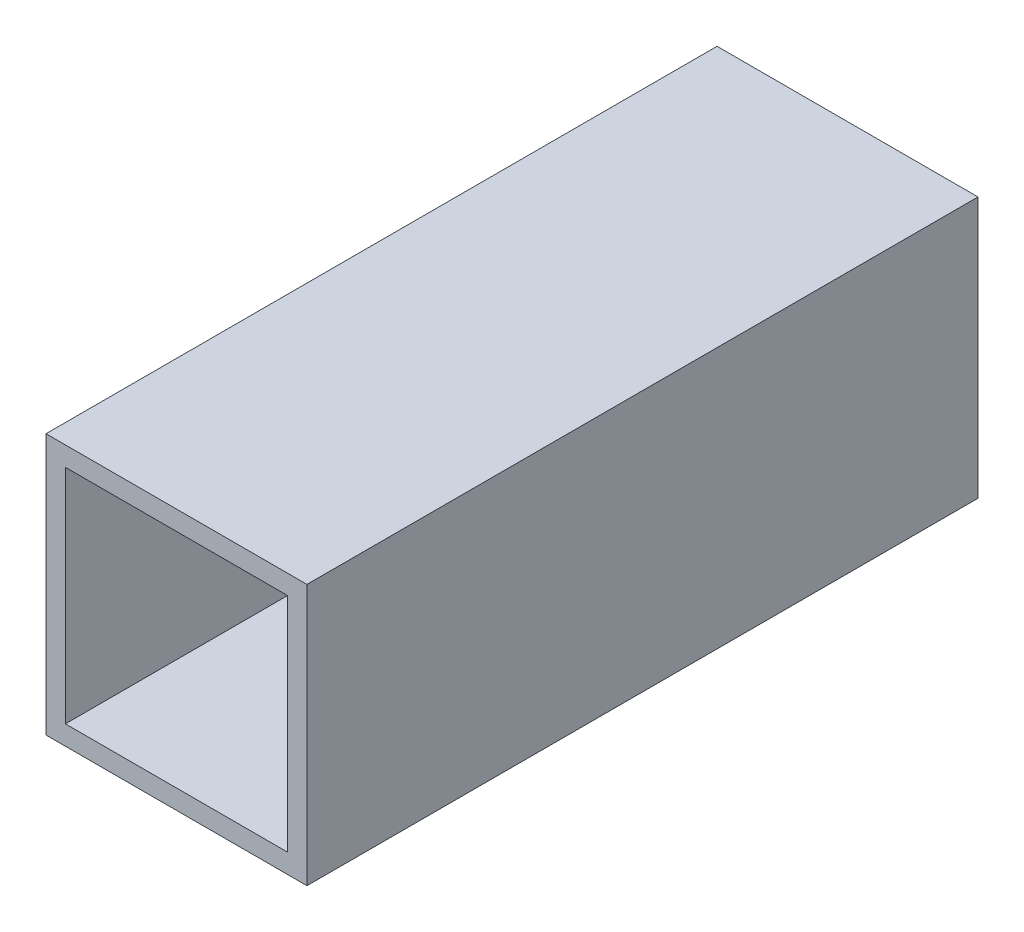
ISO-10303-21;
HEADER;
FILE_DESCRIPTION(('STEP AP214'),'2;1');
FILE_NAME('part.step','',(''),(''),'','','');
FILE_SCHEMA(('AUTOMOTIVE_DESIGN { 1 0 10303 214 1 1 1 1 }'));
ENDSEC;
DATA;
#1=APPLICATION_CONTEXT('core data for automotive mechanical design processes');
#2=APPLICATION_PROTOCOL_DEFINITION('international standard','automotive_design',2000,#1);
#3=PRODUCT_CONTEXT('',#1,'mechanical');
#4=PRODUCT('Part','Part','',(#3));
#5=PRODUCT_RELATED_PRODUCT_CATEGORY('part','',(#4));
#6=PRODUCT_DEFINITION_FORMATION('','',#4);
#7=PRODUCT_DEFINITION_CONTEXT('part definition',#1,'design');
#8=PRODUCT_DEFINITION('design','',#6,#7);
#9=PRODUCT_DEFINITION_SHAPE('','',#8);
#10=(LENGTH_UNIT() NAMED_UNIT(*) SI_UNIT(.MILLI.,.METRE.));
#11=(NAMED_UNIT(*) PLANE_ANGLE_UNIT() SI_UNIT($,.RADIAN.));
#12=(NAMED_UNIT(*) SI_UNIT($,.STERADIAN.) SOLID_ANGLE_UNIT());
#13=UNCERTAINTY_MEASURE_WITH_UNIT(LENGTH_MEASURE(1.E-05),#10,'distance_accuracy_value','');
#14=(GEOMETRIC_REPRESENTATION_CONTEXT(3) GLOBAL_UNCERTAINTY_ASSIGNED_CONTEXT((#13)) GLOBAL_UNIT_ASSIGNED_CONTEXT((#10,
#11,#12)) REPRESENTATION_CONTEXT('',''));
#15=CARTESIAN_POINT('',(0.,0.,0.));
#16=DIRECTION('',(0.,0.,1.));
#17=DIRECTION('',(1.,0.,0.));
#18=AXIS2_PLACEMENT_3D('',#15,#16,#17);
#19=CARTESIAN_POINT('',(0.,0.,114.3));
#20=DIRECTION('',(0.,0.,1.));
#21=DIRECTION('',(1.,0.,0.));
#22=AXIS2_PLACEMENT_3D('',#19,#20,#21);
#23=PLANE('',#22);
#24=DIRECTION('',(0.,1.,0.));
#25=VECTOR('',#24,1.);
#26=CARTESIAN_POINT('',(22.225,22.225,114.3));
#27=LINE('',#26,#25);
#28=CARTESIAN_POINT('',(22.225,-22.225,114.3));
#29=VERTEX_POINT('',#28);
#30=CARTESIAN_POINT('',(22.225,22.225,114.3));
#31=VERTEX_POINT('',#30);
#32=EDGE_CURVE('E149',#29,#31,#27,.T.);
#33=ORIENTED_EDGE('',*,*,#32,.T.);
#34=DIRECTION('',(-1.,0.,0.));
#35=VECTOR('',#34,1.);
#36=CARTESIAN_POINT('',(-22.225,22.225,114.3));
#37=LINE('',#36,#35);
#38=CARTESIAN_POINT('',(-22.225,22.225,114.3));
#39=VERTEX_POINT('',#38);
#40=EDGE_CURVE('E153',#31,#39,#37,.T.);
#41=ORIENTED_EDGE('',*,*,#40,.T.);
#42=DIRECTION('',(0.,-1.,0.));
#43=VECTOR('',#42,1.);
#44=CARTESIAN_POINT('',(-22.225,22.225,114.3));
#45=LINE('',#44,#43);
#46=CARTESIAN_POINT('',(-22.225,-22.225,114.3));
#47=VERTEX_POINT('',#46);
#48=EDGE_CURVE('E157',#39,#47,#45,.T.);
#49=ORIENTED_EDGE('',*,*,#48,.T.);
#50=DIRECTION('',(1.,0.,0.));
#51=VECTOR('',#50,1.);
#52=CARTESIAN_POINT('',(-22.225,-22.225,114.3));
#53=LINE('',#52,#51);
#54=EDGE_CURVE('E160',#47,#29,#53,.T.);
#55=ORIENTED_EDGE('',*,*,#54,.T.);
#56=EDGE_LOOP('',(#33,#41,#49,#55));
#57=FACE_BOUND('',#56,.T.);
#58=DIRECTION('',(-1.,0.,0.));
#59=VECTOR('',#58,1.);
#60=CARTESIAN_POINT('',(-18.923,18.923,114.3));
#61=LINE('',#60,#59);
#62=CARTESIAN_POINT('',(18.923,18.923,114.3));
#63=VERTEX_POINT('',#62);
#64=CARTESIAN_POINT('',(-18.923,18.923,114.3));
#65=VERTEX_POINT('',#64);
#66=EDGE_CURVE('E109',#63,#65,#61,.T.);
#67=ORIENTED_EDGE('',*,*,#66,.F.);
#68=DIRECTION('',(0.,1.,0.));
#69=VECTOR('',#68,1.);
#70=CARTESIAN_POINT('',(18.923,18.923,114.3));
#71=LINE('',#70,#69);
#72=CARTESIAN_POINT('',(18.923,-18.923,114.3));
#73=VERTEX_POINT('',#72);
#74=EDGE_CURVE('E100',#73,#63,#71,.T.);
#75=ORIENTED_EDGE('',*,*,#74,.F.);
#76=DIRECTION('',(1.,0.,0.));
#77=VECTOR('',#76,1.);
#78=CARTESIAN_POINT('',(-18.923,-18.923,114.3));
#79=LINE('',#78,#77);
#80=CARTESIAN_POINT('',(-18.923,-18.923,114.3));
#81=VERTEX_POINT('',#80);
#82=EDGE_CURVE('E127',#81,#73,#79,.T.);
#83=ORIENTED_EDGE('',*,*,#82,.F.);
#84=DIRECTION('',(0.,-1.,0.));
#85=VECTOR('',#84,1.);
#86=CARTESIAN_POINT('',(-18.923,18.923,114.3));
#87=LINE('',#86,#85);
#88=EDGE_CURVE('E122',#65,#81,#87,.T.);
#89=ORIENTED_EDGE('',*,*,#88,.F.);
#90=EDGE_LOOP('',(#67,#75,#83,#89));
#91=FACE_BOUND('',#90,.T.);
#92=ADVANCED_FACE('F34',(#57,#91),#23,.T.);
#93=CARTESIAN_POINT('',(0.,0.,0.));
#94=DIRECTION('',(0.,0.,1.));
#95=DIRECTION('',(1.,0.,0.));
#96=AXIS2_PLACEMENT_3D('',#93,#94,#95);
#97=PLANE('',#96);
#98=DIRECTION('',(0.,1.,0.));
#99=VECTOR('',#98,1.);
#100=CARTESIAN_POINT('',(22.225,22.225,0.));
#101=LINE('',#100,#99);
#102=CARTESIAN_POINT('',(22.225,-22.225,0.));
#103=VERTEX_POINT('',#102);
#104=CARTESIAN_POINT('',(22.225,22.225,0.));
#105=VERTEX_POINT('',#104);
#106=EDGE_CURVE('E118',#103,#105,#101,.T.);
#107=ORIENTED_EDGE('',*,*,#106,.F.);
#108=DIRECTION('',(1.,0.,0.));
#109=VECTOR('',#108,1.);
#110=CARTESIAN_POINT('',(-22.225,-22.225,0.));
#111=LINE('',#110,#109);
#112=CARTESIAN_POINT('',(-22.225,-22.225,0.));
#113=VERTEX_POINT('',#112);
#114=EDGE_CURVE('E154',#113,#103,#111,.T.);
#115=ORIENTED_EDGE('',*,*,#114,.F.);
#116=DIRECTION('',(0.,-1.,0.));
#117=VECTOR('',#116,1.);
#118=CARTESIAN_POINT('',(-22.225,22.225,0.));
#119=LINE('',#118,#117);
#120=CARTESIAN_POINT('',(-22.225,22.225,0.));
#121=VERTEX_POINT('',#120);
#122=EDGE_CURVE('E170',#121,#113,#119,.T.);
#123=ORIENTED_EDGE('',*,*,#122,.F.);
#124=DIRECTION('',(-1.,0.,0.));
#125=VECTOR('',#124,1.);
#126=CARTESIAN_POINT('',(-22.225,22.225,0.));
#127=LINE('',#126,#125);
#128=EDGE_CURVE('E167',#105,#121,#127,.T.);
#129=ORIENTED_EDGE('',*,*,#128,.F.);
#130=EDGE_LOOP('',(#107,#115,#123,#129));
#131=FACE_BOUND('',#130,.T.);
#132=DIRECTION('',(0.,1.,0.));
#133=VECTOR('',#132,1.);
#134=CARTESIAN_POINT('',(18.923,18.923,0.));
#135=LINE('',#134,#133);
#136=CARTESIAN_POINT('',(18.923,-18.923,0.));
#137=VERTEX_POINT('',#136);
#138=CARTESIAN_POINT('',(18.923,18.923,0.));
#139=VERTEX_POINT('',#138);
#140=EDGE_CURVE('E58',#137,#139,#135,.T.);
#141=ORIENTED_EDGE('',*,*,#140,.T.);
#142=DIRECTION('',(-1.,0.,0.));
#143=VECTOR('',#142,1.);
#144=CARTESIAN_POINT('',(-18.923,18.923,0.));
#145=LINE('',#144,#143);
#146=CARTESIAN_POINT('',(-18.923,18.923,0.));
#147=VERTEX_POINT('',#146);
#148=EDGE_CURVE('E116',#139,#147,#145,.T.);
#149=ORIENTED_EDGE('',*,*,#148,.T.);
#150=DIRECTION('',(0.,-1.,0.));
#151=VECTOR('',#150,1.);
#152=CARTESIAN_POINT('',(-18.923,18.923,0.));
#153=LINE('',#152,#151);
#154=CARTESIAN_POINT('',(-18.923,-18.923,0.));
#155=VERTEX_POINT('',#154);
#156=EDGE_CURVE('E136',#147,#155,#153,.T.);
#157=ORIENTED_EDGE('',*,*,#156,.T.);
#158=DIRECTION('',(1.,0.,0.));
#159=VECTOR('',#158,1.);
#160=CARTESIAN_POINT('',(-18.923,-18.923,0.));
#161=LINE('',#160,#159);
#162=EDGE_CURVE('E110',#155,#137,#161,.T.);
#163=ORIENTED_EDGE('',*,*,#162,.T.);
#164=EDGE_LOOP('',(#141,#149,#157,#163));
#165=FACE_BOUND('',#164,.T.);
#166=ADVANCED_FACE('F194',(#131,#165),#97,.F.);
#167=CARTESIAN_POINT('',(22.225,22.225,114.3));
#168=DIRECTION('',(-1.,0.,0.));
#169=DIRECTION('',(0.,-1.,0.));
#170=AXIS2_PLACEMENT_3D('',#167,#168,#169);
#171=PLANE('',#170);
#172=ORIENTED_EDGE('',*,*,#106,.T.);
#173=DIRECTION('',(0.,0.,-1.));
#174=VECTOR('',#173,1.);
#175=CARTESIAN_POINT('',(22.225,22.225,114.3));
#176=LINE('',#175,#174);
#177=EDGE_CURVE('E11',#31,#105,#176,.T.);
#178=ORIENTED_EDGE('',*,*,#177,.F.);
#179=ORIENTED_EDGE('',*,*,#32,.F.);
#180=DIRECTION('',(0.,0.,-1.));
#181=VECTOR('',#180,1.);
#182=CARTESIAN_POINT('',(22.225,-22.225,114.3));
#183=LINE('',#182,#181);
#184=EDGE_CURVE('E163',#29,#103,#183,.T.);
#185=ORIENTED_EDGE('',*,*,#184,.T.);
#186=EDGE_LOOP('',(#172,#178,#179,#185));
#187=FACE_BOUND('',#186,.T.);
#188=ADVANCED_FACE('F36',(#187),#171,.F.);
#189=CARTESIAN_POINT('',(-22.225,22.225,114.3));
#190=DIRECTION('',(0.,-1.,0.));
#191=DIRECTION('',(0.,0.,-1.));
#192=AXIS2_PLACEMENT_3D('',#189,#190,#191);
#193=PLANE('',#192);
#194=ORIENTED_EDGE('',*,*,#128,.T.);
#195=DIRECTION('',(0.,0.,-1.));
#196=VECTOR('',#195,1.);
#197=CARTESIAN_POINT('',(-22.225,22.225,114.3));
#198=LINE('',#197,#196);
#199=EDGE_CURVE('E43',#39,#121,#198,.T.);
#200=ORIENTED_EDGE('',*,*,#199,.F.);
#201=ORIENTED_EDGE('',*,*,#40,.F.);
#202=ORIENTED_EDGE('',*,*,#177,.T.);
#203=EDGE_LOOP('',(#194,#200,#201,#202));
#204=FACE_BOUND('',#203,.T.);
#205=ADVANCED_FACE('F204',(#204),#193,.F.);
#206=CARTESIAN_POINT('',(-22.225,22.225,114.3));
#207=DIRECTION('',(1.,0.,0.));
#208=DIRECTION('',(0.,1.,0.));
#209=AXIS2_PLACEMENT_3D('',#206,#207,#208);
#210=PLANE('',#209);
#211=ORIENTED_EDGE('',*,*,#122,.T.);
#212=DIRECTION('',(0.,0.,-1.));
#213=VECTOR('',#212,1.);
#214=CARTESIAN_POINT('',(-22.225,-22.225,114.3));
#215=LINE('',#214,#213);
#216=EDGE_CURVE('E178',#47,#113,#215,.T.);
#217=ORIENTED_EDGE('',*,*,#216,.F.);
#218=ORIENTED_EDGE('',*,*,#48,.F.);
#219=ORIENTED_EDGE('',*,*,#199,.T.);
#220=EDGE_LOOP('',(#211,#217,#218,#219));
#221=FACE_BOUND('',#220,.T.);
#222=ADVANCED_FACE('F188',(#221),#210,.F.);
#223=CARTESIAN_POINT('',(-22.225,-22.225,114.3));
#224=DIRECTION('',(0.,1.,0.));
#225=DIRECTION('',(0.,0.,1.));
#226=AXIS2_PLACEMENT_3D('',#223,#224,#225);
#227=PLANE('',#226);
#228=ORIENTED_EDGE('',*,*,#114,.T.);
#229=ORIENTED_EDGE('',*,*,#184,.F.);
#230=ORIENTED_EDGE('',*,*,#54,.F.);
#231=ORIENTED_EDGE('',*,*,#216,.T.);
#232=EDGE_LOOP('',(#228,#229,#230,#231));
#233=FACE_BOUND('',#232,.T.);
#234=ADVANCED_FACE('F198',(#233),#227,.F.);
#235=CARTESIAN_POINT('',(18.923,18.923,114.3));
#236=DIRECTION('',(-1.,0.,0.));
#237=DIRECTION('',(0.,0.,1.));
#238=AXIS2_PLACEMENT_3D('',#235,#236,#237);
#239=PLANE('',#238);
#240=ORIENTED_EDGE('',*,*,#140,.F.);
#241=DIRECTION('',(0.,0.,-1.));
#242=VECTOR('',#241,1.);
#243=CARTESIAN_POINT('',(18.923,-18.923,114.3));
#244=LINE('',#243,#242);
#245=EDGE_CURVE('E104',#73,#137,#244,.T.);
#246=ORIENTED_EDGE('',*,*,#245,.F.);
#247=ORIENTED_EDGE('',*,*,#74,.T.);
#248=DIRECTION('',(0.,0.,-1.));
#249=VECTOR('',#248,1.);
#250=CARTESIAN_POINT('',(18.923,18.923,114.3));
#251=LINE('',#250,#249);
#252=EDGE_CURVE('E103',#63,#139,#251,.T.);
#253=ORIENTED_EDGE('',*,*,#252,.T.);
#254=EDGE_LOOP('',(#240,#246,#247,#253));
#255=FACE_BOUND('',#254,.T.);
#256=ADVANCED_FACE('F102',(#255),#239,.T.);
#257=CARTESIAN_POINT('',(-18.923,18.923,114.3));
#258=DIRECTION('',(0.,-1.,0.));
#259=DIRECTION('',(0.,0.,-1.));
#260=AXIS2_PLACEMENT_3D('',#257,#258,#259);
#261=PLANE('',#260);
#262=ORIENTED_EDGE('',*,*,#148,.F.);
#263=ORIENTED_EDGE('',*,*,#252,.F.);
#264=ORIENTED_EDGE('',*,*,#66,.T.);
#265=DIRECTION('',(0.,0.,-1.));
#266=VECTOR('',#265,1.);
#267=CARTESIAN_POINT('',(-18.923,18.923,114.3));
#268=LINE('',#267,#266);
#269=EDGE_CURVE('E119',#65,#147,#268,.T.);
#270=ORIENTED_EDGE('',*,*,#269,.T.);
#271=EDGE_LOOP('',(#262,#263,#264,#270));
#272=FACE_BOUND('',#271,.T.);
#273=ADVANCED_FACE('F113',(#272),#261,.T.);
#274=CARTESIAN_POINT('',(-18.923,18.923,114.3));
#275=DIRECTION('',(1.,0.,0.));
#276=DIRECTION('',(0.,0.,-1.));
#277=AXIS2_PLACEMENT_3D('',#274,#275,#276);
#278=PLANE('',#277);
#279=ORIENTED_EDGE('',*,*,#156,.F.);
#280=ORIENTED_EDGE('',*,*,#269,.F.);
#281=ORIENTED_EDGE('',*,*,#88,.T.);
#282=DIRECTION('',(0.,0.,-1.));
#283=VECTOR('',#282,1.);
#284=CARTESIAN_POINT('',(-18.923,-18.923,114.3));
#285=LINE('',#284,#283);
#286=EDGE_CURVE('E50',#81,#155,#285,.T.);
#287=ORIENTED_EDGE('',*,*,#286,.T.);
#288=EDGE_LOOP('',(#279,#280,#281,#287));
#289=FACE_BOUND('',#288,.T.);
#290=ADVANCED_FACE('F227',(#289),#278,.T.);
#291=CARTESIAN_POINT('',(-18.923,-18.923,114.3));
#292=DIRECTION('',(0.,1.,0.));
#293=DIRECTION('',(0.,0.,1.));
#294=AXIS2_PLACEMENT_3D('',#291,#292,#293);
#295=PLANE('',#294);
#296=ORIENTED_EDGE('',*,*,#162,.F.);
#297=ORIENTED_EDGE('',*,*,#286,.F.);
#298=ORIENTED_EDGE('',*,*,#82,.T.);
#299=ORIENTED_EDGE('',*,*,#245,.T.);
#300=EDGE_LOOP('',(#296,#297,#298,#299));
#301=FACE_BOUND('',#300,.T.);
#302=ADVANCED_FACE('F231',(#301),#295,.T.);
#303=CLOSED_SHELL('',(#92,#166,#188,#205,#222,#234,#256,#273,#290,#302));
#304=MANIFOLD_SOLID_BREP('B2',#303);
#305=ADVANCED_BREP_SHAPE_REPRESENTATION('',(#18,#304),#14);
#306=SHAPE_DEFINITION_REPRESENTATION(#9,#305);
ENDSEC;
END-ISO-10303-21;
